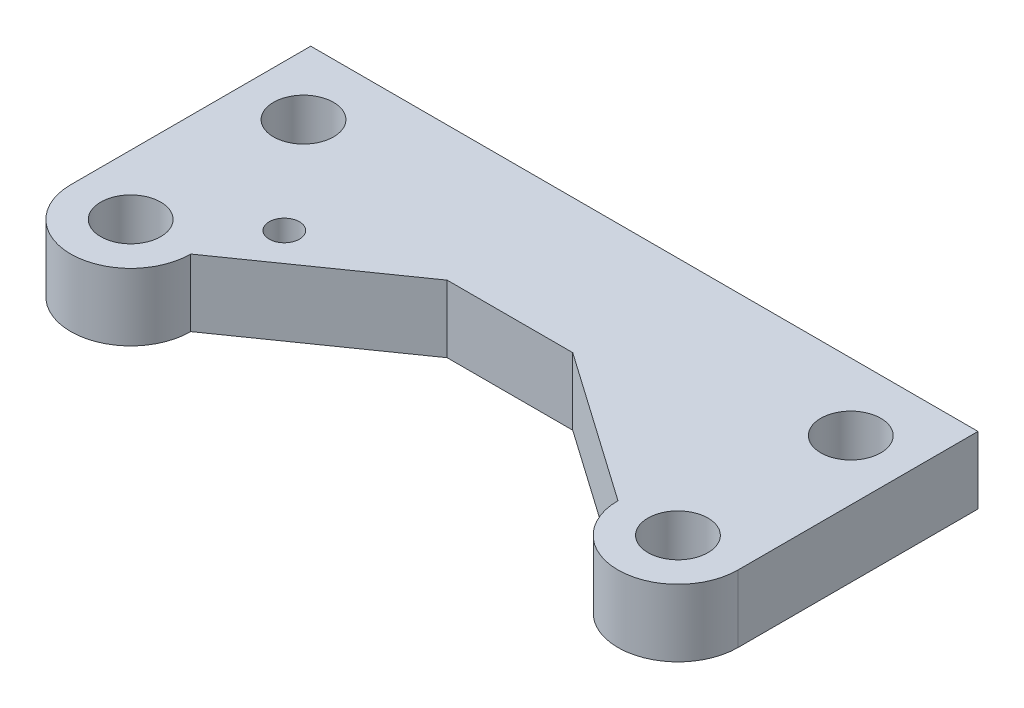
ISO-10303-21;
HEADER;
FILE_DESCRIPTION(('STEP AP214'),'2;1');
FILE_NAME('part.step','',(''),(''),'','','');
FILE_SCHEMA(('AUTOMOTIVE_DESIGN { 1 0 10303 214 1 1 1 1 }'));
ENDSEC;
DATA;
#1=APPLICATION_CONTEXT('core data for automotive mechanical design processes');
#2=APPLICATION_PROTOCOL_DEFINITION('international standard','automotive_design',2000,#1);
#3=PRODUCT_CONTEXT('',#1,'mechanical');
#4=PRODUCT('Part','Part','',(#3));
#5=PRODUCT_RELATED_PRODUCT_CATEGORY('part','',(#4));
#6=PRODUCT_DEFINITION_FORMATION('','',#4);
#7=PRODUCT_DEFINITION_CONTEXT('part definition',#1,'design');
#8=PRODUCT_DEFINITION('design','',#6,#7);
#9=PRODUCT_DEFINITION_SHAPE('','',#8);
#10=(LENGTH_UNIT() NAMED_UNIT(*) SI_UNIT(.MILLI.,.METRE.));
#11=(NAMED_UNIT(*) PLANE_ANGLE_UNIT() SI_UNIT($,.RADIAN.));
#12=(NAMED_UNIT(*) SI_UNIT($,.STERADIAN.) SOLID_ANGLE_UNIT());
#13=UNCERTAINTY_MEASURE_WITH_UNIT(LENGTH_MEASURE(1.E-05),#10,'distance_accuracy_value','');
#14=(GEOMETRIC_REPRESENTATION_CONTEXT(3) GLOBAL_UNCERTAINTY_ASSIGNED_CONTEXT((#13)) GLOBAL_UNIT_ASSIGNED_CONTEXT((#10,
#11,#12)) REPRESENTATION_CONTEXT('',''));
#15=CARTESIAN_POINT('',(0.,0.,0.));
#16=DIRECTION('',(0.,0.,1.));
#17=DIRECTION('',(1.,0.,0.));
#18=AXIS2_PLACEMENT_3D('',#15,#16,#17);
#19=CARTESIAN_POINT('',(72.39,-8.89,0.));
#20=DIRECTION('',(0.,1.,0.));
#21=DIRECTION('',(0.,0.,1.));
#22=AXIS2_PLACEMENT_3D('',#19,#20,#21);
#23=CYLINDRICAL_SURFACE('',#22,7.93749999999999);
#24=CARTESIAN_POINT('',(72.39,0.,0.));
#25=DIRECTION('',(0.,1.,0.));
#26=DIRECTION('',(0.,0.,-1.));
#27=AXIS2_PLACEMENT_3D('',#24,#25,#26);
#28=CIRCLE('',#27,7.93749999999999);
#29=CARTESIAN_POINT('',(64.4525,0.,0.));
#30=VERTEX_POINT('',#29);
#31=CARTESIAN_POINT('',(80.3275,0.,0.));
#32=VERTEX_POINT('',#31);
#33=EDGE_CURVE('E141',#30,#32,#28,.T.);
#34=ORIENTED_EDGE('',*,*,#33,.F.);
#35=DIRECTION('',(0.,1.,0.));
#36=VECTOR('',#35,1.);
#37=CARTESIAN_POINT('',(64.4525,-8.89,0.));
#38=LINE('',#37,#36);
#39=CARTESIAN_POINT('',(64.4525,-8.89,0.));
#40=VERTEX_POINT('',#39);
#41=EDGE_CURVE('E11',#40,#30,#38,.T.);
#42=ORIENTED_EDGE('',*,*,#41,.F.);
#43=CARTESIAN_POINT('',(72.39,-8.89,0.));
#44=DIRECTION('',(0.,1.,0.));
#45=DIRECTION('',(0.,0.,-1.));
#46=AXIS2_PLACEMENT_3D('',#43,#44,#45);
#47=CIRCLE('',#46,7.93749999999999);
#48=CARTESIAN_POINT('',(80.3275,-8.89,0.));
#49=VERTEX_POINT('',#48);
#50=EDGE_CURVE('E170',#40,#49,#47,.T.);
#51=ORIENTED_EDGE('',*,*,#50,.T.);
#52=DIRECTION('',(0.,1.,0.));
#53=VECTOR('',#52,1.);
#54=CARTESIAN_POINT('',(80.3275,-8.89,0.));
#55=LINE('',#54,#53);
#56=EDGE_CURVE('E42',#49,#32,#55,.T.);
#57=ORIENTED_EDGE('',*,*,#56,.T.);
#58=EDGE_LOOP('',(#34,#42,#51,#57));
#59=FACE_BOUND('',#58,.T.);
#60=ADVANCED_FACE('F39',(#59),#23,.T.);
#61=CARTESIAN_POINT('',(64.4525,-8.89,0.));
#62=DIRECTION('',(-0.573576436351047,0.,0.819152044288991));
#63=DIRECTION('',(0.819152044288991,0.,0.573576436351047));
#64=AXIS2_PLACEMENT_3D('',#61,#62,#63);
#65=PLANE('',#64);
#66=DIRECTION('',(0.819152044288991,0.,0.573576436351047));
#67=VECTOR('',#66,1.);
#68=CARTESIAN_POINT('',(64.4525,0.,0.));
#69=LINE('',#68,#67);
#70=CARTESIAN_POINT('',(44.5012723458127,0.,-13.97));
#71=VERTEX_POINT('',#70);
#72=EDGE_CURVE('E167',#71,#30,#69,.T.);
#73=ORIENTED_EDGE('',*,*,#72,.F.);
#74=DIRECTION('',(0.,1.,0.));
#75=VECTOR('',#74,1.);
#76=CARTESIAN_POINT('',(44.5012723458127,-8.89,-13.97));
#77=LINE('',#76,#75);
#78=CARTESIAN_POINT('',(44.5012723458127,-8.89,-13.97));
#79=VERTEX_POINT('',#78);
#80=EDGE_CURVE('E49',#79,#71,#77,.T.);
#81=ORIENTED_EDGE('',*,*,#80,.F.);
#82=DIRECTION('',(0.819152044288991,0.,0.573576436351047));
#83=VECTOR('',#82,1.);
#84=CARTESIAN_POINT('',(64.4525,-8.89,0.));
#85=LINE('',#84,#83);
#86=EDGE_CURVE('E127',#79,#40,#85,.T.);
#87=ORIENTED_EDGE('',*,*,#86,.T.);
#88=ORIENTED_EDGE('',*,*,#41,.T.);
#89=EDGE_LOOP('',(#73,#81,#87,#88));
#90=FACE_BOUND('',#89,.T.);
#91=ADVANCED_FACE('F189',(#90),#65,.T.);
#92=CARTESIAN_POINT('',(44.5012723458127,-8.89,-13.97));
#93=DIRECTION('',(0.,0.,1.));
#94=DIRECTION('',(1.,0.,0.));
#95=AXIS2_PLACEMENT_3D('',#92,#93,#94);
#96=PLANE('',#95);
#97=DIRECTION('',(1.,0.,0.));
#98=VECTOR('',#97,1.);
#99=CARTESIAN_POINT('',(44.5012723458127,0.,-13.97));
#100=LINE('',#99,#98);
#101=CARTESIAN_POINT('',(27.8887276541876,0.,-13.97));
#102=VERTEX_POINT('',#101);
#103=EDGE_CURVE('E113',#102,#71,#100,.T.);
#104=ORIENTED_EDGE('',*,*,#103,.F.);
#105=DIRECTION('',(0.,1.,0.));
#106=VECTOR('',#105,1.);
#107=CARTESIAN_POINT('',(27.8887276541876,-8.89,-13.97));
#108=LINE('',#107,#106);
#109=CARTESIAN_POINT('',(27.8887276541876,-8.89,-13.97));
#110=VERTEX_POINT('',#109);
#111=EDGE_CURVE('E108',#110,#102,#108,.T.);
#112=ORIENTED_EDGE('',*,*,#111,.F.);
#113=DIRECTION('',(1.,0.,0.));
#114=VECTOR('',#113,1.);
#115=CARTESIAN_POINT('',(44.5012723458127,-8.89,-13.97));
#116=LINE('',#115,#114);
#117=EDGE_CURVE('E111',#110,#79,#116,.T.);
#118=ORIENTED_EDGE('',*,*,#117,.T.);
#119=ORIENTED_EDGE('',*,*,#80,.T.);
#120=EDGE_LOOP('',(#104,#112,#118,#119));
#121=FACE_BOUND('',#120,.T.);
#122=ADVANCED_FACE('F110',(#121),#96,.T.);
#123=CARTESIAN_POINT('',(7.9375,-8.89,0.));
#124=DIRECTION('',(0.573576436351041,0.,0.819152044288995));
#125=DIRECTION('',(0.819152044288995,0.,-0.573576436351042));
#126=AXIS2_PLACEMENT_3D('',#123,#124,#125);
#127=PLANE('',#126);
#128=DIRECTION('',(0.819152044288995,0.,-0.573576436351041));
#129=VECTOR('',#128,1.);
#130=CARTESIAN_POINT('',(7.9375,0.,0.));
#131=LINE('',#130,#129);
#132=CARTESIAN_POINT('',(7.9375,0.,0.));
#133=VERTEX_POINT('',#132);
#134=EDGE_CURVE('E162',#133,#102,#131,.T.);
#135=ORIENTED_EDGE('',*,*,#134,.F.);
#136=DIRECTION('',(0.,1.,0.));
#137=VECTOR('',#136,1.);
#138=CARTESIAN_POINT('',(7.9375,-8.89,0.));
#139=LINE('',#138,#137);
#140=CARTESIAN_POINT('',(7.9375,-8.89,0.));
#141=VERTEX_POINT('',#140);
#142=EDGE_CURVE('E119',#141,#133,#139,.T.);
#143=ORIENTED_EDGE('',*,*,#142,.F.);
#144=DIRECTION('',(0.819152044288995,0.,-0.573576436351041));
#145=VECTOR('',#144,1.);
#146=CARTESIAN_POINT('',(7.9375,-8.89,0.));
#147=LINE('',#146,#145);
#148=EDGE_CURVE('E125',#141,#110,#147,.T.);
#149=ORIENTED_EDGE('',*,*,#148,.T.);
#150=ORIENTED_EDGE('',*,*,#111,.T.);
#151=EDGE_LOOP('',(#135,#143,#149,#150));
#152=FACE_BOUND('',#151,.T.);
#153=ADVANCED_FACE('F130',(#152),#127,.T.);
#154=CARTESIAN_POINT('',(0.,-8.89,0.));
#155=DIRECTION('',(0.,1.,0.));
#156=DIRECTION('',(0.,0.,1.));
#157=AXIS2_PLACEMENT_3D('',#154,#155,#156);
#158=CYLINDRICAL_SURFACE('',#157,7.9375);
#159=CARTESIAN_POINT('',(0.,0.,0.));
#160=DIRECTION('',(0.,1.,0.));
#161=DIRECTION('',(0.,0.,-1.));
#162=AXIS2_PLACEMENT_3D('',#159,#160,#161);
#163=CIRCLE('',#162,7.9375);
#164=CARTESIAN_POINT('',(-7.9375,0.,0.));
#165=VERTEX_POINT('',#164);
#166=EDGE_CURVE('E158',#165,#133,#163,.T.);
#167=ORIENTED_EDGE('',*,*,#166,.F.);
#168=DIRECTION('',(0.,1.,0.));
#169=VECTOR('',#168,1.);
#170=CARTESIAN_POINT('',(-7.9375,-8.89,0.));
#171=LINE('',#170,#169);
#172=CARTESIAN_POINT('',(-7.9375,-8.89,0.));
#173=VERTEX_POINT('',#172);
#174=EDGE_CURVE('E176',#173,#165,#171,.T.);
#175=ORIENTED_EDGE('',*,*,#174,.F.);
#176=CARTESIAN_POINT('',(0.,-8.89,0.));
#177=DIRECTION('',(0.,1.,0.));
#178=DIRECTION('',(0.,0.,-1.));
#179=AXIS2_PLACEMENT_3D('',#176,#177,#178);
#180=CIRCLE('',#179,7.9375);
#181=EDGE_CURVE('E132',#173,#141,#180,.T.);
#182=ORIENTED_EDGE('',*,*,#181,.T.);
#183=ORIENTED_EDGE('',*,*,#142,.T.);
#184=EDGE_LOOP('',(#167,#175,#182,#183));
#185=FACE_BOUND('',#184,.T.);
#186=ADVANCED_FACE('F202',(#185),#158,.T.);
#187=CARTESIAN_POINT('',(-7.9375,-8.89,0.));
#188=DIRECTION('',(-1.,0.,0.));
#189=DIRECTION('',(0.,0.,1.));
#190=AXIS2_PLACEMENT_3D('',#187,#188,#189);
#191=PLANE('',#190);
#192=DIRECTION('',(0.,0.,1.));
#193=VECTOR('',#192,1.);
#194=CARTESIAN_POINT('',(-7.9375,0.,0.));
#195=LINE('',#194,#193);
#196=CARTESIAN_POINT('',(-7.9375,0.,-31.75));
#197=VERTEX_POINT('',#196);
#198=EDGE_CURVE('E154',#197,#165,#195,.T.);
#199=ORIENTED_EDGE('',*,*,#198,.F.);
#200=DIRECTION('',(0.,1.,0.));
#201=VECTOR('',#200,1.);
#202=CARTESIAN_POINT('',(-7.9375,-8.89,-31.75));
#203=LINE('',#202,#201);
#204=CARTESIAN_POINT('',(-7.9375,-8.89,-31.75));
#205=VERTEX_POINT('',#204);
#206=EDGE_CURVE('E179',#205,#197,#203,.T.);
#207=ORIENTED_EDGE('',*,*,#206,.F.);
#208=DIRECTION('',(0.,0.,1.));
#209=VECTOR('',#208,1.);
#210=CARTESIAN_POINT('',(-7.9375,-8.89,-31.75));
#211=LINE('',#210,#209);
#212=EDGE_CURVE('E135',#205,#173,#211,.T.);
#213=ORIENTED_EDGE('',*,*,#212,.T.);
#214=ORIENTED_EDGE('',*,*,#174,.T.);
#215=EDGE_LOOP('',(#199,#207,#213,#214));
#216=FACE_BOUND('',#215,.T.);
#217=ADVANCED_FACE('F205',(#216),#191,.T.);
#218=CARTESIAN_POINT('',(80.3275,-8.89,-31.75));
#219=DIRECTION('',(0.,0.,-1.));
#220=DIRECTION('',(-1.,0.,0.));
#221=AXIS2_PLACEMENT_3D('',#218,#219,#220);
#222=PLANE('',#221);
#223=DIRECTION('',(-1.,0.,0.));
#224=VECTOR('',#223,1.);
#225=CARTESIAN_POINT('',(80.3275,0.,-31.75));
#226=LINE('',#225,#224);
#227=CARTESIAN_POINT('',(80.3275,0.,-31.75));
#228=VERTEX_POINT('',#227);
#229=EDGE_CURVE('E150',#228,#197,#226,.T.);
#230=ORIENTED_EDGE('',*,*,#229,.F.);
#231=DIRECTION('',(0.,1.,0.));
#232=VECTOR('',#231,1.);
#233=CARTESIAN_POINT('',(80.3275,-8.89,-31.75));
#234=LINE('',#233,#232);
#235=CARTESIAN_POINT('',(80.3275,-8.89,-31.75));
#236=VERTEX_POINT('',#235);
#237=EDGE_CURVE('E182',#236,#228,#234,.T.);
#238=ORIENTED_EDGE('',*,*,#237,.F.);
#239=DIRECTION('',(-1.,0.,0.));
#240=VECTOR('',#239,1.);
#241=CARTESIAN_POINT('',(80.3275,-8.89,-31.75));
#242=LINE('',#241,#240);
#243=EDGE_CURVE('E294',#236,#205,#242,.T.);
#244=ORIENTED_EDGE('',*,*,#243,.T.);
#245=ORIENTED_EDGE('',*,*,#206,.T.);
#246=EDGE_LOOP('',(#230,#238,#244,#245));
#247=FACE_BOUND('',#246,.T.);
#248=ADVANCED_FACE('F209',(#247),#222,.T.);
#249=CARTESIAN_POINT('',(80.3275,-8.89,-31.75));
#250=DIRECTION('',(1.,0.,0.));
#251=DIRECTION('',(0.,0.,-1.));
#252=AXIS2_PLACEMENT_3D('',#249,#250,#251);
#253=PLANE('',#252);
#254=DIRECTION('',(0.,0.,-1.));
#255=VECTOR('',#254,1.);
#256=CARTESIAN_POINT('',(80.3275,0.,-31.75));
#257=LINE('',#256,#255);
#258=EDGE_CURVE('E145',#32,#228,#257,.T.);
#259=ORIENTED_EDGE('',*,*,#258,.F.);
#260=ORIENTED_EDGE('',*,*,#56,.F.);
#261=DIRECTION('',(0.,0.,-1.));
#262=VECTOR('',#261,1.);
#263=CARTESIAN_POINT('',(80.3275,-8.89,-13.97));
#264=LINE('',#263,#262);
#265=EDGE_CURVE('E291',#49,#236,#264,.T.);
#266=ORIENTED_EDGE('',*,*,#265,.T.);
#267=ORIENTED_EDGE('',*,*,#237,.T.);
#268=EDGE_LOOP('',(#259,#260,#266,#267));
#269=FACE_BOUND('',#268,.T.);
#270=ADVANCED_FACE('F212',(#269),#253,.T.);
#271=CARTESIAN_POINT('',(72.39,-8.89,0.));
#272=DIRECTION('',(0.,-1.,0.));
#273=DIRECTION('',(0.,0.,-1.));
#274=AXIS2_PLACEMENT_3D('',#271,#272,#273);
#275=PLANE('',#274);
#276=CARTESIAN_POINT('',(11.43,-8.89,-8.89));
#277=DIRECTION('',(0.,1.,0.));
#278=DIRECTION('',(0.,0.,1.));
#279=AXIS2_PLACEMENT_3D('',#276,#277,#278);
#280=CIRCLE('',#279,2.);
#281=CARTESIAN_POINT('',(11.43,-8.89,-6.89));
#282=VERTEX_POINT('',#281);
#283=EDGE_CURVE('E249',#282,#282,#280,.T.);
#284=ORIENTED_EDGE('',*,*,#283,.T.);
#285=EDGE_LOOP('',(#284));
#286=FACE_BOUND('',#285,.T.);
#287=CARTESIAN_POINT('',(0.,-8.89,-22.86));
#288=DIRECTION('',(0.,1.,0.));
#289=DIRECTION('',(0.,0.,1.));
#290=AXIS2_PLACEMENT_3D('',#287,#288,#289);
#291=CIRCLE('',#290,3.96875);
#292=CARTESIAN_POINT('',(0.,-8.89,-18.89125));
#293=VERTEX_POINT('',#292);
#294=EDGE_CURVE('E259',#293,#293,#291,.T.);
#295=ORIENTED_EDGE('',*,*,#294,.T.);
#296=EDGE_LOOP('',(#295));
#297=FACE_BOUND('',#296,.T.);
#298=CARTESIAN_POINT('',(72.39,-8.89,-22.86));
#299=DIRECTION('',(0.,1.,0.));
#300=DIRECTION('',(0.,0.,1.));
#301=AXIS2_PLACEMENT_3D('',#298,#299,#300);
#302=CIRCLE('',#301,3.96875000000001);
#303=CARTESIAN_POINT('',(72.39,-8.89,-18.89125));
#304=VERTEX_POINT('',#303);
#305=EDGE_CURVE('E267',#304,#304,#302,.T.);
#306=ORIENTED_EDGE('',*,*,#305,.T.);
#307=EDGE_LOOP('',(#306));
#308=FACE_BOUND('',#307,.T.);
#309=CARTESIAN_POINT('',(72.39,-8.89,0.));
#310=DIRECTION('',(0.,1.,0.));
#311=DIRECTION('',(0.,0.,1.));
#312=AXIS2_PLACEMENT_3D('',#309,#310,#311);
#313=CIRCLE('',#312,3.96875);
#314=CARTESIAN_POINT('',(72.39,-8.89,3.96875));
#315=VERTEX_POINT('',#314);
#316=EDGE_CURVE('E275',#315,#315,#313,.T.);
#317=ORIENTED_EDGE('',*,*,#316,.T.);
#318=EDGE_LOOP('',(#317));
#319=FACE_BOUND('',#318,.T.);
#320=CARTESIAN_POINT('',(0.,-8.89,0.));
#321=DIRECTION('',(0.,1.,0.));
#322=DIRECTION('',(0.,0.,1.));
#323=AXIS2_PLACEMENT_3D('',#320,#321,#322);
#324=CIRCLE('',#323,3.96875);
#325=CARTESIAN_POINT('',(0.,-8.89,3.96875));
#326=VERTEX_POINT('',#325);
#327=EDGE_CURVE('E146',#326,#326,#324,.T.);
#328=ORIENTED_EDGE('',*,*,#327,.T.);
#329=EDGE_LOOP('',(#328));
#330=FACE_BOUND('',#329,.T.);
#331=ORIENTED_EDGE('',*,*,#50,.F.);
#332=ORIENTED_EDGE('',*,*,#86,.F.);
#333=ORIENTED_EDGE('',*,*,#117,.F.);
#334=ORIENTED_EDGE('',*,*,#148,.F.);
#335=ORIENTED_EDGE('',*,*,#181,.F.);
#336=ORIENTED_EDGE('',*,*,#212,.F.);
#337=ORIENTED_EDGE('',*,*,#243,.F.);
#338=ORIENTED_EDGE('',*,*,#265,.F.);
#339=EDGE_LOOP('',(#331,#332,#333,#334,#335,#336,#337,#338));
#340=FACE_BOUND('',#339,.T.);
#341=ADVANCED_FACE('F123',(#286,#297,#308,#319,#330,#340),#275,.T.);
#342=CARTESIAN_POINT('',(72.39,0.,0.));
#343=DIRECTION('',(0.,-1.,0.));
#344=DIRECTION('',(0.,0.,-1.));
#345=AXIS2_PLACEMENT_3D('',#342,#343,#344);
#346=PLANE('',#345);
#347=CARTESIAN_POINT('',(11.43,0.,-8.89));
#348=DIRECTION('',(0.,1.,0.));
#349=DIRECTION('',(0.,0.,1.));
#350=AXIS2_PLACEMENT_3D('',#347,#348,#349);
#351=CIRCLE('',#350,2.);
#352=CARTESIAN_POINT('',(11.43,0.,-6.89));
#353=VERTEX_POINT('',#352);
#354=EDGE_CURVE('E252',#353,#353,#351,.T.);
#355=ORIENTED_EDGE('',*,*,#354,.F.);
#356=EDGE_LOOP('',(#355));
#357=FACE_BOUND('',#356,.T.);
#358=CARTESIAN_POINT('',(0.,0.,-22.86));
#359=DIRECTION('',(0.,1.,0.));
#360=DIRECTION('',(0.,0.,1.));
#361=AXIS2_PLACEMENT_3D('',#358,#359,#360);
#362=CIRCLE('',#361,3.96875);
#363=CARTESIAN_POINT('',(0.,0.,-18.89125));
#364=VERTEX_POINT('',#363);
#365=EDGE_CURVE('E256',#364,#364,#362,.T.);
#366=ORIENTED_EDGE('',*,*,#365,.F.);
#367=EDGE_LOOP('',(#366));
#368=FACE_BOUND('',#367,.T.);
#369=CARTESIAN_POINT('',(72.39,0.,-22.86));
#370=DIRECTION('',(0.,1.,0.));
#371=DIRECTION('',(0.,0.,1.));
#372=AXIS2_PLACEMENT_3D('',#369,#370,#371);
#373=CIRCLE('',#372,3.96875000000001);
#374=CARTESIAN_POINT('',(72.39,0.,-18.89125));
#375=VERTEX_POINT('',#374);
#376=EDGE_CURVE('E263',#375,#375,#373,.T.);
#377=ORIENTED_EDGE('',*,*,#376,.F.);
#378=EDGE_LOOP('',(#377));
#379=FACE_BOUND('',#378,.T.);
#380=CARTESIAN_POINT('',(72.39,0.,0.));
#381=DIRECTION('',(0.,1.,0.));
#382=DIRECTION('',(0.,0.,1.));
#383=AXIS2_PLACEMENT_3D('',#380,#381,#382);
#384=CIRCLE('',#383,3.96875);
#385=CARTESIAN_POINT('',(72.39,0.,3.96875));
#386=VERTEX_POINT('',#385);
#387=EDGE_CURVE('E271',#386,#386,#384,.T.);
#388=ORIENTED_EDGE('',*,*,#387,.F.);
#389=EDGE_LOOP('',(#388));
#390=FACE_BOUND('',#389,.T.);
#391=CARTESIAN_POINT('',(0.,0.,0.));
#392=DIRECTION('',(0.,1.,0.));
#393=DIRECTION('',(0.,0.,1.));
#394=AXIS2_PLACEMENT_3D('',#391,#392,#393);
#395=CIRCLE('',#394,3.96875);
#396=CARTESIAN_POINT('',(0.,0.,3.96875));
#397=VERTEX_POINT('',#396);
#398=EDGE_CURVE('E279',#397,#397,#395,.T.);
#399=ORIENTED_EDGE('',*,*,#398,.F.);
#400=EDGE_LOOP('',(#399));
#401=FACE_BOUND('',#400,.T.);
#402=ORIENTED_EDGE('',*,*,#33,.T.);
#403=ORIENTED_EDGE('',*,*,#258,.T.);
#404=ORIENTED_EDGE('',*,*,#229,.T.);
#405=ORIENTED_EDGE('',*,*,#198,.T.);
#406=ORIENTED_EDGE('',*,*,#166,.T.);
#407=ORIENTED_EDGE('',*,*,#134,.T.);
#408=ORIENTED_EDGE('',*,*,#103,.T.);
#409=ORIENTED_EDGE('',*,*,#72,.T.);
#410=EDGE_LOOP('',(#402,#403,#404,#405,#406,#407,#408,#409));
#411=FACE_BOUND('',#410,.T.);
#412=ADVANCED_FACE('F188',(#357,#368,#379,#390,#401,#411),#346,.F.);
#413=CARTESIAN_POINT('',(0.,-8.89,0.));
#414=DIRECTION('',(0.,1.,0.));
#415=DIRECTION('',(0.,0.,1.));
#416=AXIS2_PLACEMENT_3D('',#413,#414,#415);
#417=CYLINDRICAL_SURFACE('',#416,3.96875);
#418=ORIENTED_EDGE('',*,*,#327,.F.);
#419=EDGE_LOOP('',(#418));
#420=FACE_BOUND('',#419,.T.);
#421=ORIENTED_EDGE('',*,*,#398,.T.);
#422=EDGE_LOOP('',(#421));
#423=FACE_BOUND('',#422,.T.);
#424=ADVANCED_FACE('F222',(#420,#423),#417,.F.);
#425=CARTESIAN_POINT('',(72.39,-8.89,0.));
#426=DIRECTION('',(0.,1.,0.));
#427=DIRECTION('',(0.,0.,1.));
#428=AXIS2_PLACEMENT_3D('',#425,#426,#427);
#429=CYLINDRICAL_SURFACE('',#428,3.96875);
#430=ORIENTED_EDGE('',*,*,#316,.F.);
#431=EDGE_LOOP('',(#430));
#432=FACE_BOUND('',#431,.T.);
#433=ORIENTED_EDGE('',*,*,#387,.T.);
#434=EDGE_LOOP('',(#433));
#435=FACE_BOUND('',#434,.T.);
#436=ADVANCED_FACE('F229',(#432,#435),#429,.F.);
#437=CARTESIAN_POINT('',(72.39,-8.89,-22.86));
#438=DIRECTION('',(0.,1.,0.));
#439=DIRECTION('',(0.,0.,1.));
#440=AXIS2_PLACEMENT_3D('',#437,#438,#439);
#441=CYLINDRICAL_SURFACE('',#440,3.96875000000001);
#442=ORIENTED_EDGE('',*,*,#305,.F.);
#443=EDGE_LOOP('',(#442));
#444=FACE_BOUND('',#443,.T.);
#445=ORIENTED_EDGE('',*,*,#376,.T.);
#446=EDGE_LOOP('',(#445));
#447=FACE_BOUND('',#446,.T.);
#448=ADVANCED_FACE('F233',(#444,#447),#441,.F.);
#449=CARTESIAN_POINT('',(0.,-8.89,-22.86));
#450=DIRECTION('',(0.,1.,0.));
#451=DIRECTION('',(0.,0.,1.));
#452=AXIS2_PLACEMENT_3D('',#449,#450,#451);
#453=CYLINDRICAL_SURFACE('',#452,3.96875);
#454=ORIENTED_EDGE('',*,*,#294,.F.);
#455=EDGE_LOOP('',(#454));
#456=FACE_BOUND('',#455,.T.);
#457=ORIENTED_EDGE('',*,*,#365,.T.);
#458=EDGE_LOOP('',(#457));
#459=FACE_BOUND('',#458,.T.);
#460=ADVANCED_FACE('F237',(#456,#459),#453,.F.);
#461=CARTESIAN_POINT('',(11.43,-8.89,-8.89));
#462=DIRECTION('',(0.,1.,0.));
#463=DIRECTION('',(0.,0.,1.));
#464=AXIS2_PLACEMENT_3D('',#461,#462,#463);
#465=CYLINDRICAL_SURFACE('',#464,2.);
#466=ORIENTED_EDGE('',*,*,#283,.F.);
#467=EDGE_LOOP('',(#466));
#468=FACE_BOUND('',#467,.T.);
#469=ORIENTED_EDGE('',*,*,#354,.T.);
#470=EDGE_LOOP('',(#469));
#471=FACE_BOUND('',#470,.T.);
#472=ADVANCED_FACE('F241',(#468,#471),#465,.F.);
#473=CLOSED_SHELL('',(#60,#91,#122,#153,#186,#217,#248,#270,#341,#412,#424,#436,#448,#460,#472));
#474=MANIFOLD_SOLID_BREP('B2',#473);
#475=ADVANCED_BREP_SHAPE_REPRESENTATION('',(#18,#474),#14);
#476=SHAPE_DEFINITION_REPRESENTATION(#9,#475);
ENDSEC;
END-ISO-10303-21;
